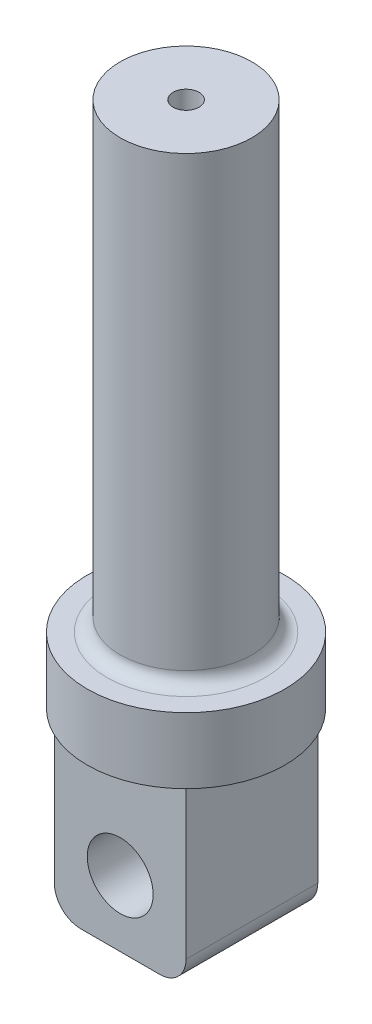
ISO-10303-21;
HEADER;
FILE_DESCRIPTION(('STEP AP214'),'2;1');
FILE_NAME('part.step','',(''),(''),'','','');
FILE_SCHEMA(('AUTOMOTIVE_DESIGN { 1 0 10303 214 1 1 1 1 }'));
ENDSEC;
DATA;
#1=APPLICATION_CONTEXT('core data for automotive mechanical design processes');
#2=APPLICATION_PROTOCOL_DEFINITION('international standard','automotive_design',2000,#1);
#3=PRODUCT_CONTEXT('',#1,'mechanical');
#4=PRODUCT('Part','Part','',(#3));
#5=PRODUCT_RELATED_PRODUCT_CATEGORY('part','',(#4));
#6=PRODUCT_DEFINITION_FORMATION('','',#4);
#7=PRODUCT_DEFINITION_CONTEXT('part definition',#1,'design');
#8=PRODUCT_DEFINITION('design','',#6,#7);
#9=PRODUCT_DEFINITION_SHAPE('','',#8);
#10=(LENGTH_UNIT() NAMED_UNIT(*) SI_UNIT(.MILLI.,.METRE.));
#11=(NAMED_UNIT(*) PLANE_ANGLE_UNIT() SI_UNIT($,.RADIAN.));
#12=(NAMED_UNIT(*) SI_UNIT($,.STERADIAN.) SOLID_ANGLE_UNIT());
#13=UNCERTAINTY_MEASURE_WITH_UNIT(LENGTH_MEASURE(1.E-05),#10,'distance_accuracy_value','');
#14=(GEOMETRIC_REPRESENTATION_CONTEXT(3) GLOBAL_UNCERTAINTY_ASSIGNED_CONTEXT((#13)) GLOBAL_UNIT_ASSIGNED_CONTEXT((#10,
#11,#12)) REPRESENTATION_CONTEXT('',''));
#15=CARTESIAN_POINT('',(0.,0.,0.));
#16=DIRECTION('',(0.,0.,1.));
#17=DIRECTION('',(1.,0.,0.));
#18=AXIS2_PLACEMENT_3D('',#15,#16,#17);
#19=CARTESIAN_POINT('',(12.7,34.31697226,0.));
#20=DIRECTION('',(-1.,0.,0.));
#21=DIRECTION('',(0.,0.,1.));
#22=AXIS2_PLACEMENT_3D('',#19,#20,#21);
#23=PLANE('',#22);
#24=DIRECTION('',(0.,-1.,0.));
#25=VECTOR('',#24,1.);
#26=CARTESIAN_POINT('',(12.7,34.31697226,12.7));
#27=LINE('',#26,#25);
#28=CARTESIAN_POINT('',(12.7,34.31697226,12.7));
#29=VERTEX_POINT('',#28);
#30=CARTESIAN_POINT('',(12.7,5.08,12.7));
#31=VERTEX_POINT('',#30);
#32=EDGE_CURVE('E141',#29,#31,#27,.T.);
#33=ORIENTED_EDGE('',*,*,#32,.T.);
#34=DIRECTION('',(0.,0.,-1.));
#35=VECTOR('',#34,1.);
#36=CARTESIAN_POINT('',(12.7,5.08,0.));
#37=LINE('',#36,#35);
#38=CARTESIAN_POINT('',(12.7,5.08,-12.7));
#39=VERTEX_POINT('',#38);
#40=EDGE_CURVE('E156',#31,#39,#37,.T.);
#41=ORIENTED_EDGE('',*,*,#40,.T.);
#42=DIRECTION('',(0.,-1.,0.));
#43=VECTOR('',#42,1.);
#44=CARTESIAN_POINT('',(12.7,34.31697226,-12.7));
#45=LINE('',#44,#43);
#46=CARTESIAN_POINT('',(12.7,34.31697226,-12.7));
#47=VERTEX_POINT('',#46);
#48=EDGE_CURVE('E153',#47,#39,#45,.T.);
#49=ORIENTED_EDGE('',*,*,#48,.F.);
#50=DIRECTION('',(0.,0.,-1.));
#51=VECTOR('',#50,1.);
#52=CARTESIAN_POINT('',(12.7,34.31697226,12.7));
#53=LINE('',#52,#51);
#54=EDGE_CURVE('E128',#29,#47,#53,.T.);
#55=ORIENTED_EDGE('',*,*,#54,.F.);
#56=EDGE_LOOP('',(#33,#41,#49,#55));
#57=FACE_BOUND('',#56,.T.);
#58=ADVANCED_FACE('F41',(#57),#23,.F.);
#59=CARTESIAN_POINT('',(0.,34.31697226,-12.7));
#60=DIRECTION('',(0.,0.,1.));
#61=DIRECTION('',(1.,0.,0.));
#62=AXIS2_PLACEMENT_3D('',#59,#60,#61);
#63=PLANE('',#62);
#64=CARTESIAN_POINT('',(0.,12.7,-12.7));
#65=DIRECTION('',(0.,0.,1.));
#66=DIRECTION('',(1.,0.,0.));
#67=AXIS2_PLACEMENT_3D('',#64,#65,#66);
#68=CIRCLE('',#67,6.35);
#69=CARTESIAN_POINT('',(6.35,12.7,-12.7));
#70=VERTEX_POINT('',#69);
#71=EDGE_CURVE('E111',#70,#70,#68,.T.);
#72=ORIENTED_EDGE('',*,*,#71,.T.);
#73=EDGE_LOOP('',(#72));
#74=FACE_BOUND('',#73,.T.);
#75=ORIENTED_EDGE('',*,*,#48,.T.);
#76=CARTESIAN_POINT('',(7.62,5.08,-12.7));
#77=DIRECTION('',(0.,0.,1.));
#78=DIRECTION('',(1.,0.,0.));
#79=AXIS2_PLACEMENT_3D('',#76,#77,#78);
#80=CIRCLE('',#79,5.08);
#81=CARTESIAN_POINT('',(7.62,0.,-12.7));
#82=VERTEX_POINT('',#81);
#83=EDGE_CURVE('E161',#39,#82,#80,.F.);
#84=ORIENTED_EDGE('',*,*,#83,.T.);
#85=DIRECTION('',(-1.,0.,0.));
#86=VECTOR('',#85,1.);
#87=CARTESIAN_POINT('',(0.,0.,-12.7));
#88=LINE('',#87,#86);
#89=CARTESIAN_POINT('',(-7.62,0.,-12.7));
#90=VERTEX_POINT('',#89);
#91=EDGE_CURVE('E125',#82,#90,#88,.T.);
#92=ORIENTED_EDGE('',*,*,#91,.T.);
#93=CARTESIAN_POINT('',(-7.62,5.08,-12.7));
#94=DIRECTION('',(0.,0.,1.));
#95=DIRECTION('',(1.,0.,0.));
#96=AXIS2_PLACEMENT_3D('',#93,#94,#95);
#97=CIRCLE('',#96,5.08);
#98=CARTESIAN_POINT('',(-12.7,5.08,-12.7));
#99=VERTEX_POINT('',#98);
#100=EDGE_CURVE('E159',#90,#99,#97,.F.);
#101=ORIENTED_EDGE('',*,*,#100,.T.);
#102=DIRECTION('',(0.,-1.,0.));
#103=VECTOR('',#102,1.);
#104=CARTESIAN_POINT('',(-12.7,34.31697226,-12.7));
#105=LINE('',#104,#103);
#106=CARTESIAN_POINT('',(-12.7,34.31697226,-12.7));
#107=VERTEX_POINT('',#106);
#108=EDGE_CURVE('E150',#107,#99,#105,.T.);
#109=ORIENTED_EDGE('',*,*,#108,.F.);
#110=DIRECTION('',(-1.,0.,0.));
#111=VECTOR('',#110,1.);
#112=CARTESIAN_POINT('',(12.7,34.31697226,-12.7));
#113=LINE('',#112,#111);
#114=EDGE_CURVE('E131',#47,#107,#113,.T.);
#115=ORIENTED_EDGE('',*,*,#114,.F.);
#116=EDGE_LOOP('',(#75,#84,#92,#101,#109,#115));
#117=FACE_BOUND('',#116,.T.);
#118=ADVANCED_FACE('F187',(#74,#117),#63,.F.);
#119=CARTESIAN_POINT('',(-12.7,34.31697226,0.));
#120=DIRECTION('',(1.,0.,0.));
#121=DIRECTION('',(0.,0.,-1.));
#122=AXIS2_PLACEMENT_3D('',#119,#120,#121);
#123=PLANE('',#122);
#124=ORIENTED_EDGE('',*,*,#108,.T.);
#125=DIRECTION('',(0.,0.,1.));
#126=VECTOR('',#125,1.);
#127=CARTESIAN_POINT('',(-12.7,5.08,0.));
#128=LINE('',#127,#126);
#129=CARTESIAN_POINT('',(-12.7,5.08,12.7));
#130=VERTEX_POINT('',#129);
#131=EDGE_CURVE('E169',#99,#130,#128,.T.);
#132=ORIENTED_EDGE('',*,*,#131,.T.);
#133=DIRECTION('',(0.,-1.,0.));
#134=VECTOR('',#133,1.);
#135=CARTESIAN_POINT('',(-12.7,34.31697226,12.7));
#136=LINE('',#135,#134);
#137=CARTESIAN_POINT('',(-12.7,34.31697226,12.7));
#138=VERTEX_POINT('',#137);
#139=EDGE_CURVE('E147',#138,#130,#136,.T.);
#140=ORIENTED_EDGE('',*,*,#139,.F.);
#141=DIRECTION('',(0.,0.,1.));
#142=VECTOR('',#141,1.);
#143=CARTESIAN_POINT('',(-12.7,34.31697226,-12.7));
#144=LINE('',#143,#142);
#145=EDGE_CURVE('E135',#107,#138,#144,.T.);
#146=ORIENTED_EDGE('',*,*,#145,.F.);
#147=EDGE_LOOP('',(#124,#132,#140,#146));
#148=FACE_BOUND('',#147,.T.);
#149=ADVANCED_FACE('F194',(#148),#123,.F.);
#150=CARTESIAN_POINT('',(0.,34.31697226,12.7));
#151=DIRECTION('',(0.,0.,-1.));
#152=DIRECTION('',(-1.,0.,0.));
#153=AXIS2_PLACEMENT_3D('',#150,#151,#152);
#154=PLANE('',#153);
#155=CARTESIAN_POINT('',(0.,12.7,12.7));
#156=DIRECTION('',(0.,0.,1.));
#157=DIRECTION('',(1.,0.,0.));
#158=AXIS2_PLACEMENT_3D('',#155,#156,#157);
#159=CIRCLE('',#158,6.35);
#160=CARTESIAN_POINT('',(6.35,12.7,12.7));
#161=VERTEX_POINT('',#160);
#162=EDGE_CURVE('E107',#161,#161,#159,.T.);
#163=ORIENTED_EDGE('',*,*,#162,.F.);
#164=EDGE_LOOP('',(#163));
#165=FACE_BOUND('',#164,.T.);
#166=DIRECTION('',(1.,0.,0.));
#167=VECTOR('',#166,1.);
#168=CARTESIAN_POINT('',(0.,0.,12.7));
#169=LINE('',#168,#167);
#170=CARTESIAN_POINT('',(-7.62,0.,12.7));
#171=VERTEX_POINT('',#170);
#172=CARTESIAN_POINT('',(7.61999999999999,0.,12.7));
#173=VERTEX_POINT('',#172);
#174=EDGE_CURVE('E132',#171,#173,#169,.T.);
#175=ORIENTED_EDGE('',*,*,#174,.T.);
#176=CARTESIAN_POINT('',(7.61999999999999,5.08,12.7));
#177=DIRECTION('',(0.,0.,-1.));
#178=DIRECTION('',(-1.,0.,0.));
#179=AXIS2_PLACEMENT_3D('',#176,#177,#178);
#180=CIRCLE('',#179,5.08);
#181=EDGE_CURVE('E167',#173,#31,#180,.F.);
#182=ORIENTED_EDGE('',*,*,#181,.T.);
#183=ORIENTED_EDGE('',*,*,#32,.F.);
#184=DIRECTION('',(1.,0.,0.));
#185=VECTOR('',#184,1.);
#186=CARTESIAN_POINT('',(-12.7,34.31697226,12.7));
#187=LINE('',#186,#185);
#188=EDGE_CURVE('E138',#138,#29,#187,.T.);
#189=ORIENTED_EDGE('',*,*,#188,.F.);
#190=ORIENTED_EDGE('',*,*,#139,.T.);
#191=CARTESIAN_POINT('',(-7.62,5.08,12.7));
#192=DIRECTION('',(0.,0.,-1.));
#193=DIRECTION('',(-1.,0.,0.));
#194=AXIS2_PLACEMENT_3D('',#191,#192,#193);
#195=CIRCLE('',#194,5.08);
#196=EDGE_CURVE('E56',#130,#171,#195,.F.);
#197=ORIENTED_EDGE('',*,*,#196,.T.);
#198=EDGE_LOOP('',(#175,#182,#183,#189,#190,#197));
#199=FACE_BOUND('',#198,.T.);
#200=ADVANCED_FACE('F212',(#165,#199),#154,.F.);
#201=CARTESIAN_POINT('',(0.,0.,0.));
#202=DIRECTION('',(0.,1.,0.));
#203=DIRECTION('',(0.,0.,1.));
#204=AXIS2_PLACEMENT_3D('',#201,#202,#203);
#205=PLANE('',#204);
#206=ORIENTED_EDGE('',*,*,#91,.F.);
#207=DIRECTION('',(0.,0.,-1.));
#208=VECTOR('',#207,1.);
#209=CARTESIAN_POINT('',(7.62,0.,0.));
#210=LINE('',#209,#208);
#211=EDGE_CURVE('E64',#82,#173,#210,.F.);
#212=ORIENTED_EDGE('',*,*,#211,.T.);
#213=ORIENTED_EDGE('',*,*,#174,.F.);
#214=DIRECTION('',(0.,0.,1.));
#215=VECTOR('',#214,1.);
#216=CARTESIAN_POINT('',(-7.62,0.,0.));
#217=LINE('',#216,#215);
#218=EDGE_CURVE('E163',#171,#90,#217,.F.);
#219=ORIENTED_EDGE('',*,*,#218,.T.);
#220=EDGE_LOOP('',(#206,#212,#213,#219));
#221=FACE_BOUND('',#220,.T.);
#222=ADVANCED_FACE('F221',(#221),#205,.F.);
#223=CARTESIAN_POINT('',(0.,34.31697226,0.));
#224=DIRECTION('',(0.,1.,0.));
#225=DIRECTION('',(0.,0.,1.));
#226=AXIS2_PLACEMENT_3D('',#223,#224,#225);
#227=PLANE('',#226);
#228=CARTESIAN_POINT('',(0.,34.31697226,0.));
#229=DIRECTION('',(0.,1.,0.));
#230=DIRECTION('',(0.,0.,1.));
#231=AXIS2_PLACEMENT_3D('',#228,#229,#230);
#232=CIRCLE('',#231,19.05);
#233=CARTESIAN_POINT('',(0.,34.31697226,19.05));
#234=VERTEX_POINT('',#233);
#235=EDGE_CURVE('E121',#234,#234,#232,.T.);
#236=ORIENTED_EDGE('',*,*,#235,.F.);
#237=EDGE_LOOP('',(#236));
#238=FACE_BOUND('',#237,.T.);
#239=ORIENTED_EDGE('',*,*,#188,.T.);
#240=ORIENTED_EDGE('',*,*,#54,.T.);
#241=ORIENTED_EDGE('',*,*,#114,.T.);
#242=ORIENTED_EDGE('',*,*,#145,.T.);
#243=EDGE_LOOP('',(#239,#240,#241,#242));
#244=FACE_BOUND('',#243,.T.);
#245=ADVANCED_FACE('F216',(#238,#244),#227,.F.);
#246=CARTESIAN_POINT('',(0.,47.01697226,0.));
#247=DIRECTION('',(0.,-1.,0.));
#248=DIRECTION('',(0.,0.,-1.));
#249=AXIS2_PLACEMENT_3D('',#246,#247,#248);
#250=CYLINDRICAL_SURFACE('',#249,19.05);
#251=CARTESIAN_POINT('',(0.,47.01697226,0.));
#252=DIRECTION('',(0.,1.,0.));
#253=DIRECTION('',(0.,0.,1.));
#254=AXIS2_PLACEMENT_3D('',#251,#252,#253);
#255=CIRCLE('',#254,19.05);
#256=CARTESIAN_POINT('',(0.,47.01697226,19.05));
#257=VERTEX_POINT('',#256);
#258=EDGE_CURVE('E122',#257,#257,#255,.T.);
#259=ORIENTED_EDGE('',*,*,#258,.F.);
#260=EDGE_LOOP('',(#259));
#261=FACE_BOUND('',#260,.T.);
#262=ORIENTED_EDGE('',*,*,#235,.T.);
#263=EDGE_LOOP('',(#262));
#264=FACE_BOUND('',#263,.T.);
#265=ADVANCED_FACE('F227',(#261,#264),#250,.T.);
#266=CARTESIAN_POINT('',(0.,47.01697226,0.));
#267=DIRECTION('',(0.,1.,0.));
#268=DIRECTION('',(0.,0.,1.));
#269=AXIS2_PLACEMENT_3D('',#266,#267,#268);
#270=PLANE('',#269);
#271=CARTESIAN_POINT('',(0.,47.01697226,0.));
#272=DIRECTION('',(0.,1.,0.));
#273=DIRECTION('',(0.,0.,1.));
#274=AXIS2_PLACEMENT_3D('',#271,#272,#273);
#275=CIRCLE('',#274,15.24);
#276=CARTESIAN_POINT('',(0.,47.01697226,15.24));
#277=VERTEX_POINT('',#276);
#278=EDGE_CURVE('E11',#277,#277,#275,.F.);
#279=ORIENTED_EDGE('',*,*,#278,.T.);
#280=EDGE_LOOP('',(#279));
#281=FACE_BOUND('',#280,.T.);
#282=ORIENTED_EDGE('',*,*,#258,.T.);
#283=EDGE_LOOP('',(#282));
#284=FACE_BOUND('',#283,.T.);
#285=ADVANCED_FACE('F265',(#281,#284),#270,.T.);
#286=CARTESIAN_POINT('',(0.,135.91697226,0.));
#287=DIRECTION('',(0.,-1.,0.));
#288=DIRECTION('',(0.,0.,-1.));
#289=AXIS2_PLACEMENT_3D('',#286,#287,#288);
#290=CYLINDRICAL_SURFACE('',#289,12.7);
#291=CARTESIAN_POINT('',(0.,49.55697226,0.));
#292=DIRECTION('',(0.,1.,0.));
#293=DIRECTION('',(0.,0.,1.));
#294=AXIS2_PLACEMENT_3D('',#291,#292,#293);
#295=CIRCLE('',#294,12.7);
#296=CARTESIAN_POINT('',(0.,49.55697226,12.7));
#297=VERTEX_POINT('',#296);
#298=EDGE_CURVE('E49',#297,#297,#295,.T.);
#299=ORIENTED_EDGE('',*,*,#298,.T.);
#300=EDGE_LOOP('',(#299));
#301=FACE_BOUND('',#300,.T.);
#302=CARTESIAN_POINT('',(0.,135.91697226,0.));
#303=DIRECTION('',(0.,1.,0.));
#304=DIRECTION('',(0.,0.,1.));
#305=AXIS2_PLACEMENT_3D('',#302,#303,#304);
#306=CIRCLE('',#305,12.7);
#307=CARTESIAN_POINT('',(0.,135.91697226,12.7));
#308=VERTEX_POINT('',#307);
#309=EDGE_CURVE('E118',#308,#308,#306,.T.);
#310=ORIENTED_EDGE('',*,*,#309,.F.);
#311=EDGE_LOOP('',(#310));
#312=FACE_BOUND('',#311,.T.);
#313=ADVANCED_FACE('F173',(#301,#312),#290,.T.);
#314=CARTESIAN_POINT('',(0.,135.91697226,0.));
#315=DIRECTION('',(0.,1.,0.));
#316=DIRECTION('',(0.,0.,1.));
#317=AXIS2_PLACEMENT_3D('',#314,#315,#316);
#318=PLANE('',#317);
#319=CARTESIAN_POINT('',(0.,135.91697226,0.));
#320=DIRECTION('',(0.,1.,0.));
#321=DIRECTION('',(0.,0.,1.));
#322=AXIS2_PLACEMENT_3D('',#319,#320,#321);
#323=CIRCLE('',#322,2.49999999999999);
#324=CARTESIAN_POINT('',(0.,135.91697226,2.49999999999999));
#325=VERTEX_POINT('',#324);
#326=EDGE_CURVE('E108',#325,#325,#323,.T.);
#327=ORIENTED_EDGE('',*,*,#326,.F.);
#328=EDGE_LOOP('',(#327));
#329=FACE_BOUND('',#328,.T.);
#330=ORIENTED_EDGE('',*,*,#309,.T.);
#331=EDGE_LOOP('',(#330));
#332=FACE_BOUND('',#331,.T.);
#333=ADVANCED_FACE('F205',(#329,#332),#318,.T.);
#334=CARTESIAN_POINT('',(0.,12.7,-19.05));
#335=DIRECTION('',(0.,0.,1.));
#336=DIRECTION('',(1.,0.,0.));
#337=AXIS2_PLACEMENT_3D('',#334,#335,#336);
#338=CYLINDRICAL_SURFACE('',#337,6.35);
#339=ORIENTED_EDGE('',*,*,#162,.T.);
#340=EDGE_LOOP('',(#339));
#341=FACE_BOUND('',#340,.T.);
#342=ORIENTED_EDGE('',*,*,#71,.F.);
#343=EDGE_LOOP('',(#342));
#344=FACE_BOUND('',#343,.T.);
#345=ADVANCED_FACE('F200',(#341,#344),#338,.F.);
#346=CARTESIAN_POINT('',(7.62,5.08,0.));
#347=DIRECTION('',(0.,0.,-1.));
#348=DIRECTION('',(-1.,0.,0.));
#349=AXIS2_PLACEMENT_3D('',#346,#347,#348);
#350=CYLINDRICAL_SURFACE('',#349,5.08);
#351=ORIENTED_EDGE('',*,*,#181,.F.);
#352=ORIENTED_EDGE('',*,*,#211,.F.);
#353=ORIENTED_EDGE('',*,*,#83,.F.);
#354=ORIENTED_EDGE('',*,*,#40,.F.);
#355=EDGE_LOOP('',(#351,#352,#353,#354));
#356=FACE_BOUND('',#355,.T.);
#357=ADVANCED_FACE('F184',(#356),#350,.T.);
#358=CARTESIAN_POINT('',(-7.62,5.08,0.));
#359=DIRECTION('',(0.,0.,1.));
#360=DIRECTION('',(1.,0.,0.));
#361=AXIS2_PLACEMENT_3D('',#358,#359,#360);
#362=CYLINDRICAL_SURFACE('',#361,5.08);
#363=ORIENTED_EDGE('',*,*,#100,.F.);
#364=ORIENTED_EDGE('',*,*,#218,.F.);
#365=ORIENTED_EDGE('',*,*,#196,.F.);
#366=ORIENTED_EDGE('',*,*,#131,.F.);
#367=EDGE_LOOP('',(#363,#364,#365,#366));
#368=FACE_BOUND('',#367,.T.);
#369=ADVANCED_FACE('F177',(#368),#362,.T.);
#370=CARTESIAN_POINT('',(0.,49.55697226,0.));
#371=DIRECTION('',(0.,1.,0.));
#372=DIRECTION('',(0.,0.,1.));
#373=AXIS2_PLACEMENT_3D('',#370,#371,#372);
#374=TOROIDAL_SURFACE('',#373,15.24,2.54);
#375=ORIENTED_EDGE('',*,*,#278,.F.);
#376=EDGE_LOOP('',(#375));
#377=FACE_BOUND('',#376,.T.);
#378=ORIENTED_EDGE('',*,*,#298,.F.);
#379=EDGE_LOOP('',(#378));
#380=FACE_BOUND('',#379,.T.);
#381=ADVANCED_FACE('F43',(#377,#380),#374,.F.);
#382=CARTESIAN_POINT('',(0.,94.76897226,0.));
#383=DIRECTION('',(0.,1.,0.));
#384=DIRECTION('',(0.,0.,1.));
#385=AXIS2_PLACEMENT_3D('',#382,#383,#384);
#386=CONICAL_SURFACE('',#385,2.49999999999999,1.02974425867665);
#387=CARTESIAN_POINT('',(0.,93.2668207124311,0.));
#388=VERTEX_POINT('',#387);
#389=VERTEX_LOOP('',#388);
#390=FACE_BOUND('',#389,.T.);
#391=CARTESIAN_POINT('',(0.,94.76897226,0.));
#392=DIRECTION('',(0.,1.,0.));
#393=DIRECTION('',(0.,0.,1.));
#394=AXIS2_PLACEMENT_3D('',#391,#392,#393);
#395=CIRCLE('',#394,2.49999999999999);
#396=CARTESIAN_POINT('',(0.,94.76897226,2.49999999999999));
#397=VERTEX_POINT('',#396);
#398=EDGE_CURVE('E105',#397,#397,#395,.T.);
#399=ORIENTED_EDGE('',*,*,#398,.T.);
#400=EDGE_LOOP('',(#399));
#401=FACE_BOUND('',#400,.T.);
#402=ADVANCED_FACE('F98',(#390,#401),#386,.F.);
#403=CARTESIAN_POINT('',(0.,135.91697226,0.));
#404=DIRECTION('',(0.,1.,0.));
#405=DIRECTION('',(0.,0.,1.));
#406=AXIS2_PLACEMENT_3D('',#403,#404,#405);
#407=CYLINDRICAL_SURFACE('',#406,2.49999999999999);
#408=ORIENTED_EDGE('',*,*,#398,.F.);
#409=EDGE_LOOP('',(#408));
#410=FACE_BOUND('',#409,.T.);
#411=ORIENTED_EDGE('',*,*,#326,.T.);
#412=EDGE_LOOP('',(#411));
#413=FACE_BOUND('',#412,.T.);
#414=ADVANCED_FACE('F101',(#410,#413),#407,.F.);
#415=CLOSED_SHELL('',(#58,#118,#149,#200,#222,#245,#265,#285,#313,#333,#345,#357,#369,#381,#402,#414));
#416=MANIFOLD_SOLID_BREP('B2',#415);
#417=ADVANCED_BREP_SHAPE_REPRESENTATION('',(#18,#416),#14);
#418=SHAPE_DEFINITION_REPRESENTATION(#9,#417);
ENDSEC;
END-ISO-10303-21;
